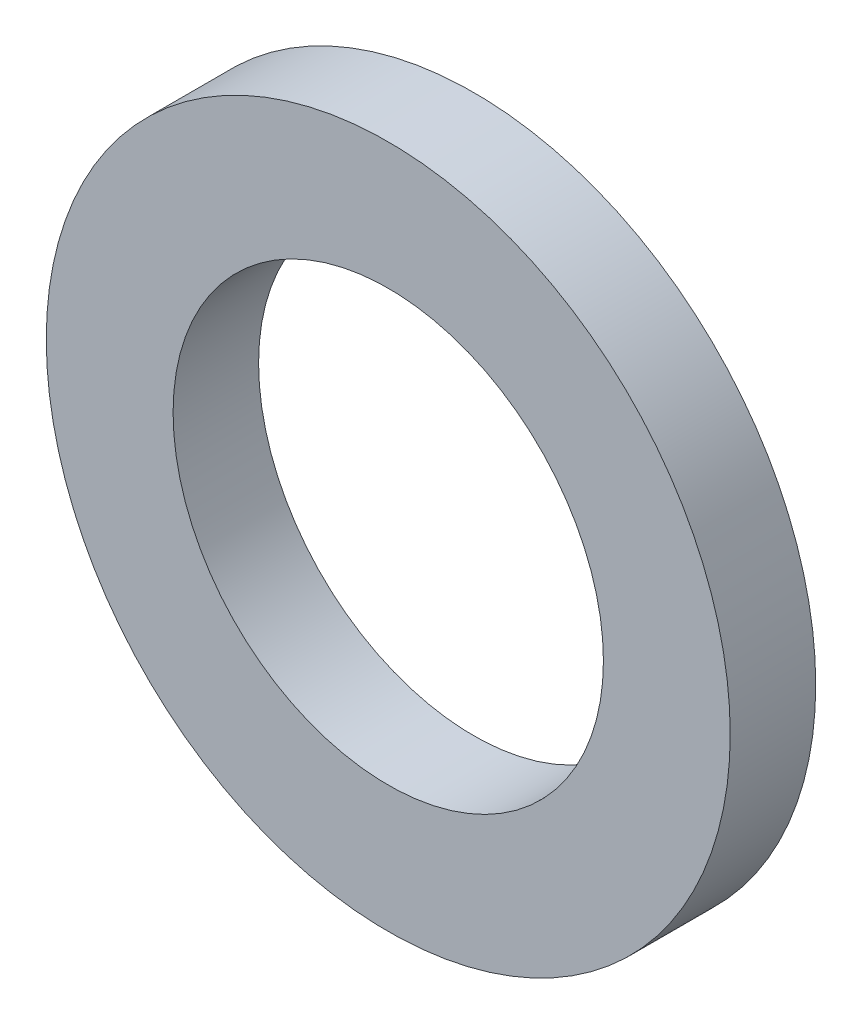
ISO-10303-21;
HEADER;
FILE_DESCRIPTION(('STEP AP214'),'2;1');
FILE_NAME('part.step','',(''),(''),'','','');
FILE_SCHEMA(('AUTOMOTIVE_DESIGN { 1 0 10303 214 1 1 1 1 }'));
ENDSEC;
DATA;
#1=APPLICATION_CONTEXT('core data for automotive mechanical design processes');
#2=APPLICATION_PROTOCOL_DEFINITION('international standard','automotive_design',2000,#1);
#3=PRODUCT_CONTEXT('',#1,'mechanical');
#4=PRODUCT('Part','Part','',(#3));
#5=PRODUCT_RELATED_PRODUCT_CATEGORY('part','',(#4));
#6=PRODUCT_DEFINITION_FORMATION('','',#4);
#7=PRODUCT_DEFINITION_CONTEXT('part definition',#1,'design');
#8=PRODUCT_DEFINITION('design','',#6,#7);
#9=PRODUCT_DEFINITION_SHAPE('','',#8);
#10=(LENGTH_UNIT() NAMED_UNIT(*) SI_UNIT(.MILLI.,.METRE.));
#11=(NAMED_UNIT(*) PLANE_ANGLE_UNIT() SI_UNIT($,.RADIAN.));
#12=(NAMED_UNIT(*) SI_UNIT($,.STERADIAN.) SOLID_ANGLE_UNIT());
#13=UNCERTAINTY_MEASURE_WITH_UNIT(LENGTH_MEASURE(1.E-05),#10,'distance_accuracy_value','');
#14=(GEOMETRIC_REPRESENTATION_CONTEXT(3) GLOBAL_UNCERTAINTY_ASSIGNED_CONTEXT((#13)) GLOBAL_UNIT_ASSIGNED_CONTEXT((#10,
#11,#12)) REPRESENTATION_CONTEXT('',''));
#15=CARTESIAN_POINT('',(0.,0.,0.));
#16=DIRECTION('',(0.,0.,1.));
#17=DIRECTION('',(1.,0.,0.));
#18=AXIS2_PLACEMENT_3D('',#15,#16,#17);
#19=CARTESIAN_POINT('',(0.,0.,3.));
#20=DIRECTION('',(0.,0.,1.));
#21=DIRECTION('',(1.,0.,0.));
#22=AXIS2_PLACEMENT_3D('',#19,#20,#21);
#23=PLANE('',#22);
#24=CARTESIAN_POINT('',(0.,0.,3.));
#25=DIRECTION('',(0.,0.,1.));
#26=DIRECTION('',(1.,0.,0.));
#27=AXIS2_PLACEMENT_3D('',#24,#25,#26);
#28=CIRCLE('',#27,12.);
#29=CARTESIAN_POINT('',(12.,0.,3.));
#30=VERTEX_POINT('',#29);
#31=EDGE_CURVE('E10',#30,#30,#28,.T.);
#32=ORIENTED_EDGE('',*,*,#31,.T.);
#33=EDGE_LOOP('',(#32));
#34=FACE_BOUND('',#33,.T.);
#35=CARTESIAN_POINT('',(0.,0.,3.));
#36=DIRECTION('',(0.,0.,1.));
#37=DIRECTION('',(1.,0.,0.));
#38=AXIS2_PLACEMENT_3D('',#35,#36,#37);
#39=CIRCLE('',#38,7.55);
#40=CARTESIAN_POINT('',(7.55,0.,3.));
#41=VERTEX_POINT('',#40);
#42=EDGE_CURVE('E56',#41,#41,#39,.T.);
#43=ORIENTED_EDGE('',*,*,#42,.F.);
#44=EDGE_LOOP('',(#43));
#45=FACE_BOUND('',#44,.T.);
#46=ADVANCED_FACE('F45',(#34,#45),#23,.T.);
#47=CARTESIAN_POINT('',(0.,0.,0.));
#48=DIRECTION('',(0.,0.,1.));
#49=DIRECTION('',(1.,0.,0.));
#50=AXIS2_PLACEMENT_3D('',#47,#48,#49);
#51=PLANE('',#50);
#52=CARTESIAN_POINT('',(0.,0.,0.));
#53=DIRECTION('',(0.,0.,1.));
#54=DIRECTION('',(1.,0.,0.));
#55=AXIS2_PLACEMENT_3D('',#52,#53,#54);
#56=CIRCLE('',#55,12.);
#57=CARTESIAN_POINT('',(12.,0.,0.));
#58=VERTEX_POINT('',#57);
#59=EDGE_CURVE('E49',#58,#58,#56,.T.);
#60=ORIENTED_EDGE('',*,*,#59,.F.);
#61=EDGE_LOOP('',(#60));
#62=FACE_BOUND('',#61,.T.);
#63=CARTESIAN_POINT('',(0.,0.,0.));
#64=DIRECTION('',(0.,0.,1.));
#65=DIRECTION('',(1.,0.,0.));
#66=AXIS2_PLACEMENT_3D('',#63,#64,#65);
#67=CIRCLE('',#66,7.55);
#68=CARTESIAN_POINT('',(7.55,0.,0.));
#69=VERTEX_POINT('',#68);
#70=EDGE_CURVE('E58',#69,#69,#67,.T.);
#71=ORIENTED_EDGE('',*,*,#70,.T.);
#72=EDGE_LOOP('',(#71));
#73=FACE_BOUND('',#72,.T.);
#74=ADVANCED_FACE('F68',(#62,#73),#51,.F.);
#75=CARTESIAN_POINT('',(0.,0.,3.));
#76=DIRECTION('',(0.,0.,-1.));
#77=DIRECTION('',(-1.,0.,0.));
#78=AXIS2_PLACEMENT_3D('',#75,#76,#77);
#79=CYLINDRICAL_SURFACE('',#78,12.);
#80=ORIENTED_EDGE('',*,*,#31,.F.);
#81=EDGE_LOOP('',(#80));
#82=FACE_BOUND('',#81,.T.);
#83=ORIENTED_EDGE('',*,*,#59,.T.);
#84=EDGE_LOOP('',(#83));
#85=FACE_BOUND('',#84,.T.);
#86=ADVANCED_FACE('F47',(#82,#85),#79,.T.);
#87=CARTESIAN_POINT('',(0.,0.,3.));
#88=DIRECTION('',(0.,0.,-1.));
#89=DIRECTION('',(-1.,0.,0.));
#90=AXIS2_PLACEMENT_3D('',#87,#88,#89);
#91=CYLINDRICAL_SURFACE('',#90,7.55);
#92=ORIENTED_EDGE('',*,*,#42,.T.);
#93=EDGE_LOOP('',(#92));
#94=FACE_BOUND('',#93,.T.);
#95=ORIENTED_EDGE('',*,*,#70,.F.);
#96=EDGE_LOOP('',(#95));
#97=FACE_BOUND('',#96,.T.);
#98=ADVANCED_FACE('F64',(#94,#97),#91,.F.);
#99=CLOSED_SHELL('',(#46,#74,#86,#98));
#100=MANIFOLD_SOLID_BREP('B2',#99);
#101=ADVANCED_BREP_SHAPE_REPRESENTATION('',(#18,#100),#14);
#102=SHAPE_DEFINITION_REPRESENTATION(#9,#101);
ENDSEC;
END-ISO-10303-21;
